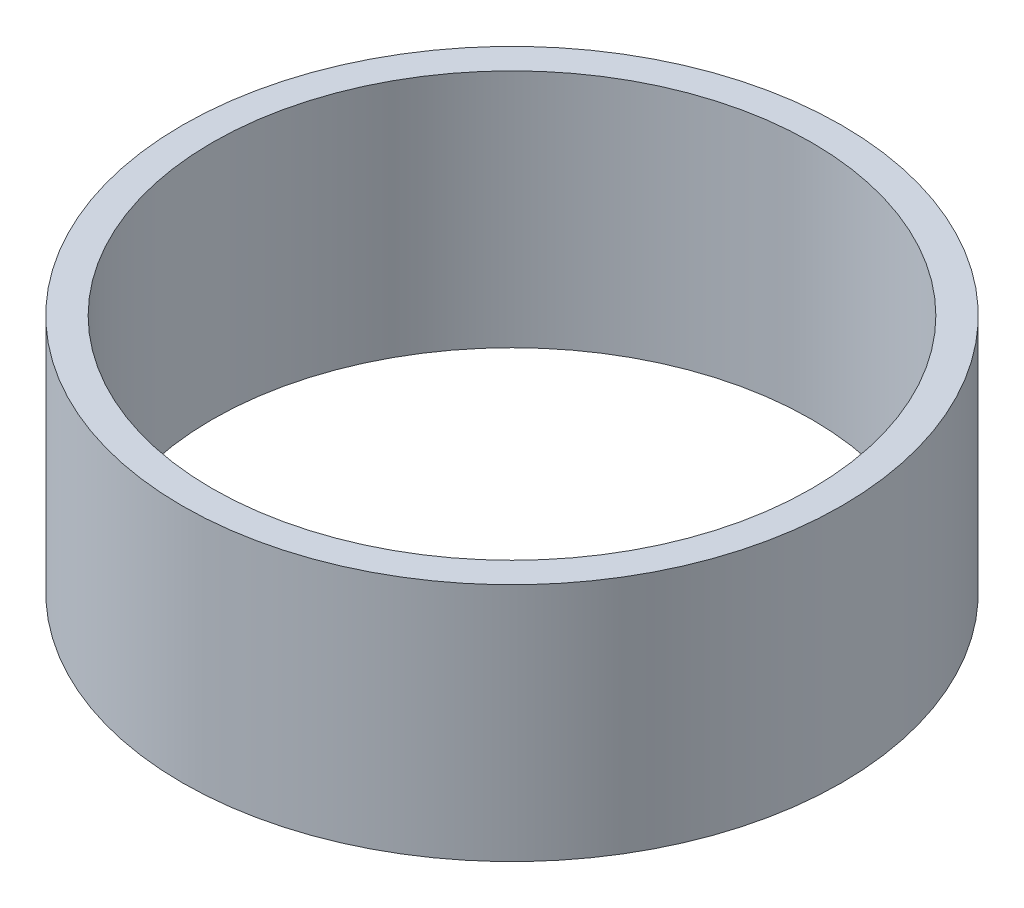
ISO-10303-21;
HEADER;
FILE_DESCRIPTION(('STEP AP214'),'2;1');
FILE_NAME('part.step','',(''),(''),'','','');
FILE_SCHEMA(('AUTOMOTIVE_DESIGN { 1 0 10303 214 1 1 1 1 }'));
ENDSEC;
DATA;
#1=APPLICATION_CONTEXT('core data for automotive mechanical design processes');
#2=APPLICATION_PROTOCOL_DEFINITION('international standard','automotive_design',2000,#1);
#3=PRODUCT_CONTEXT('',#1,'mechanical');
#4=PRODUCT('Part','Part','',(#3));
#5=PRODUCT_RELATED_PRODUCT_CATEGORY('part','',(#4));
#6=PRODUCT_DEFINITION_FORMATION('','',#4);
#7=PRODUCT_DEFINITION_CONTEXT('part definition',#1,'design');
#8=PRODUCT_DEFINITION('design','',#6,#7);
#9=PRODUCT_DEFINITION_SHAPE('','',#8);
#10=(LENGTH_UNIT() NAMED_UNIT(*) SI_UNIT(.MILLI.,.METRE.));
#11=(NAMED_UNIT(*) PLANE_ANGLE_UNIT() SI_UNIT($,.RADIAN.));
#12=(NAMED_UNIT(*) SI_UNIT($,.STERADIAN.) SOLID_ANGLE_UNIT());
#13=UNCERTAINTY_MEASURE_WITH_UNIT(LENGTH_MEASURE(1.E-05),#10,'distance_accuracy_value','');
#14=(GEOMETRIC_REPRESENTATION_CONTEXT(3) GLOBAL_UNCERTAINTY_ASSIGNED_CONTEXT((#13)) GLOBAL_UNIT_ASSIGNED_CONTEXT((#10,
#11,#12)) REPRESENTATION_CONTEXT('',''));
#15=CARTESIAN_POINT('',(0.,0.,0.));
#16=DIRECTION('',(0.,0.,1.));
#17=DIRECTION('',(1.,0.,0.));
#18=AXIS2_PLACEMENT_3D('',#15,#16,#17);
#19=CARTESIAN_POINT('',(0.,8.,0.));
#20=DIRECTION('',(0.,-1.,0.));
#21=DIRECTION('',(0.,0.,-1.));
#22=AXIS2_PLACEMENT_3D('',#19,#20,#21);
#23=CYLINDRICAL_SURFACE('',#22,11.);
#24=CARTESIAN_POINT('',(0.,8.,0.));
#25=DIRECTION('',(0.,1.,0.));
#26=DIRECTION('',(0.,0.,1.));
#27=AXIS2_PLACEMENT_3D('',#24,#25,#26);
#28=CIRCLE('',#27,11.);
#29=CARTESIAN_POINT('',(0.,8.,11.));
#30=VERTEX_POINT('',#29);
#31=EDGE_CURVE('E10',#30,#30,#28,.T.);
#32=ORIENTED_EDGE('',*,*,#31,.F.);
#33=EDGE_LOOP('',(#32));
#34=FACE_BOUND('',#33,.T.);
#35=CARTESIAN_POINT('',(0.,0.,0.));
#36=DIRECTION('',(0.,1.,0.));
#37=DIRECTION('',(0.,0.,1.));
#38=AXIS2_PLACEMENT_3D('',#35,#36,#37);
#39=CIRCLE('',#38,11.);
#40=CARTESIAN_POINT('',(0.,0.,11.));
#41=VERTEX_POINT('',#40);
#42=EDGE_CURVE('E40',#41,#41,#39,.T.);
#43=ORIENTED_EDGE('',*,*,#42,.T.);
#44=EDGE_LOOP('',(#43));
#45=FACE_BOUND('',#44,.T.);
#46=ADVANCED_FACE('F37',(#34,#45),#23,.T.);
#47=CARTESIAN_POINT('',(0.,8.,0.));
#48=DIRECTION('',(0.,1.,0.));
#49=DIRECTION('',(0.,0.,1.));
#50=AXIS2_PLACEMENT_3D('',#47,#48,#49);
#51=PLANE('',#50);
#52=CARTESIAN_POINT('',(0.,8.,0.));
#53=DIRECTION('',(0.,1.,0.));
#54=DIRECTION('',(0.,0.,1.));
#55=AXIS2_PLACEMENT_3D('',#52,#53,#54);
#56=CIRCLE('',#55,10.);
#57=CARTESIAN_POINT('',(0.,8.,10.));
#58=VERTEX_POINT('',#57);
#59=EDGE_CURVE('E49',#58,#58,#56,.T.);
#60=ORIENTED_EDGE('',*,*,#59,.F.);
#61=EDGE_LOOP('',(#60));
#62=FACE_BOUND('',#61,.T.);
#63=ORIENTED_EDGE('',*,*,#31,.T.);
#64=EDGE_LOOP('',(#63));
#65=FACE_BOUND('',#64,.T.);
#66=ADVANCED_FACE('F64',(#62,#65),#51,.T.);
#67=CARTESIAN_POINT('',(0.,0.,0.));
#68=DIRECTION('',(0.,1.,0.));
#69=DIRECTION('',(0.,0.,1.));
#70=AXIS2_PLACEMENT_3D('',#67,#68,#69);
#71=PLANE('',#70);
#72=CARTESIAN_POINT('',(0.,0.,0.));
#73=DIRECTION('',(0.,1.,0.));
#74=DIRECTION('',(0.,0.,1.));
#75=AXIS2_PLACEMENT_3D('',#72,#73,#74);
#76=CIRCLE('',#75,10.);
#77=CARTESIAN_POINT('',(0.,0.,10.));
#78=VERTEX_POINT('',#77);
#79=EDGE_CURVE('E47',#78,#78,#76,.T.);
#80=ORIENTED_EDGE('',*,*,#79,.T.);
#81=EDGE_LOOP('',(#80));
#82=FACE_BOUND('',#81,.T.);
#83=ORIENTED_EDGE('',*,*,#42,.F.);
#84=EDGE_LOOP('',(#83));
#85=FACE_BOUND('',#84,.T.);
#86=ADVANCED_FACE('F55',(#82,#85),#71,.F.);
#87=CARTESIAN_POINT('',(0.,0.,0.));
#88=DIRECTION('',(0.,1.,0.));
#89=DIRECTION('',(0.,0.,1.));
#90=AXIS2_PLACEMENT_3D('',#87,#88,#89);
#91=CYLINDRICAL_SURFACE('',#90,10.);
#92=ORIENTED_EDGE('',*,*,#79,.F.);
#93=EDGE_LOOP('',(#92));
#94=FACE_BOUND('',#93,.T.);
#95=ORIENTED_EDGE('',*,*,#59,.T.);
#96=EDGE_LOOP('',(#95));
#97=FACE_BOUND('',#96,.T.);
#98=ADVANCED_FACE('F58',(#94,#97),#91,.F.);
#99=CLOSED_SHELL('',(#46,#66,#86,#98));
#100=MANIFOLD_SOLID_BREP('B2',#99);
#101=ADVANCED_BREP_SHAPE_REPRESENTATION('',(#18,#100),#14);
#102=SHAPE_DEFINITION_REPRESENTATION(#9,#101);
ENDSEC;
END-ISO-10303-21;
